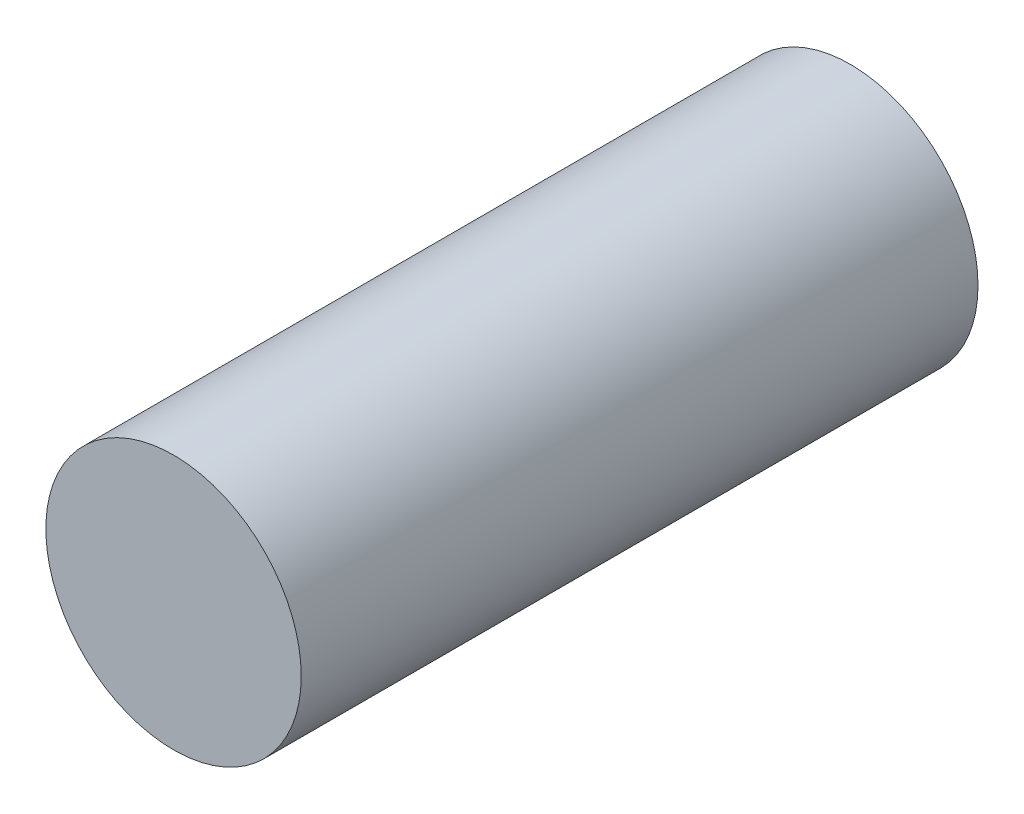
ISO-10303-21;
HEADER;
FILE_DESCRIPTION(('STEP AP214'),'2;1');
FILE_NAME('part.step','',(''),(''),'','','');
FILE_SCHEMA(('AUTOMOTIVE_DESIGN { 1 0 10303 214 1 1 1 1 }'));
ENDSEC;
DATA;
#1=APPLICATION_CONTEXT('core data for automotive mechanical design processes');
#2=APPLICATION_PROTOCOL_DEFINITION('international standard','automotive_design',2000,#1);
#3=PRODUCT_CONTEXT('',#1,'mechanical');
#4=PRODUCT('Part','Part','',(#3));
#5=PRODUCT_RELATED_PRODUCT_CATEGORY('part','',(#4));
#6=PRODUCT_DEFINITION_FORMATION('','',#4);
#7=PRODUCT_DEFINITION_CONTEXT('part definition',#1,'design');
#8=PRODUCT_DEFINITION('design','',#6,#7);
#9=PRODUCT_DEFINITION_SHAPE('','',#8);
#10=(LENGTH_UNIT() NAMED_UNIT(*) SI_UNIT(.MILLI.,.METRE.));
#11=(NAMED_UNIT(*) PLANE_ANGLE_UNIT() SI_UNIT($,.RADIAN.));
#12=(NAMED_UNIT(*) SI_UNIT($,.STERADIAN.) SOLID_ANGLE_UNIT());
#13=UNCERTAINTY_MEASURE_WITH_UNIT(LENGTH_MEASURE(1.E-05),#10,'distance_accuracy_value','');
#14=(GEOMETRIC_REPRESENTATION_CONTEXT(3) GLOBAL_UNCERTAINTY_ASSIGNED_CONTEXT((#13)) GLOBAL_UNIT_ASSIGNED_CONTEXT((#10,
#11,#12)) REPRESENTATION_CONTEXT('',''));
#15=CARTESIAN_POINT('',(0.,0.,0.));
#16=DIRECTION('',(0.,0.,1.));
#17=DIRECTION('',(1.,0.,0.));
#18=AXIS2_PLACEMENT_3D('',#15,#16,#17);
#19=CARTESIAN_POINT('',(0.,0.,265.));
#20=DIRECTION('',(0.,0.,-1.));
#21=DIRECTION('',(-1.,0.,0.));
#22=AXIS2_PLACEMENT_3D('',#19,#20,#21);
#23=CYLINDRICAL_SURFACE('',#22,50.);
#24=CARTESIAN_POINT('',(0.,0.,265.));
#25=DIRECTION('',(0.,0.,1.));
#26=DIRECTION('',(1.,0.,0.));
#27=AXIS2_PLACEMENT_3D('',#24,#25,#26);
#28=CIRCLE('',#27,50.);
#29=CARTESIAN_POINT('',(50.,0.,265.));
#30=VERTEX_POINT('',#29);
#31=EDGE_CURVE('E10',#30,#30,#28,.T.);
#32=ORIENTED_EDGE('',*,*,#31,.F.);
#33=EDGE_LOOP('',(#32));
#34=FACE_BOUND('',#33,.T.);
#35=CARTESIAN_POINT('',(0.,0.,0.));
#36=DIRECTION('',(0.,0.,1.));
#37=DIRECTION('',(1.,0.,0.));
#38=AXIS2_PLACEMENT_3D('',#35,#36,#37);
#39=CIRCLE('',#38,50.);
#40=CARTESIAN_POINT('',(50.,0.,0.));
#41=VERTEX_POINT('',#40);
#42=EDGE_CURVE('E40',#41,#41,#39,.T.);
#43=ORIENTED_EDGE('',*,*,#42,.T.);
#44=EDGE_LOOP('',(#43));
#45=FACE_BOUND('',#44,.T.);
#46=ADVANCED_FACE('F37',(#34,#45),#23,.T.);
#47=CARTESIAN_POINT('',(0.,0.,265.));
#48=DIRECTION('',(0.,0.,1.));
#49=DIRECTION('',(1.,0.,0.));
#50=AXIS2_PLACEMENT_3D('',#47,#48,#49);
#51=PLANE('',#50);
#52=ORIENTED_EDGE('',*,*,#31,.T.);
#53=EDGE_LOOP('',(#52));
#54=FACE_BOUND('',#53,.T.);
#55=ADVANCED_FACE('F52',(#54),#51,.T.);
#56=CARTESIAN_POINT('',(0.,0.,0.));
#57=DIRECTION('',(0.,0.,1.));
#58=DIRECTION('',(1.,0.,0.));
#59=AXIS2_PLACEMENT_3D('',#56,#57,#58);
#60=PLANE('',#59);
#61=ORIENTED_EDGE('',*,*,#42,.F.);
#62=EDGE_LOOP('',(#61));
#63=FACE_BOUND('',#62,.T.);
#64=ADVANCED_FACE('F50',(#63),#60,.F.);
#65=CLOSED_SHELL('',(#46,#55,#64));
#66=MANIFOLD_SOLID_BREP('B2',#65);
#67=ADVANCED_BREP_SHAPE_REPRESENTATION('',(#18,#66),#14);
#68=SHAPE_DEFINITION_REPRESENTATION(#9,#67);
ENDSEC;
END-ISO-10303-21;
